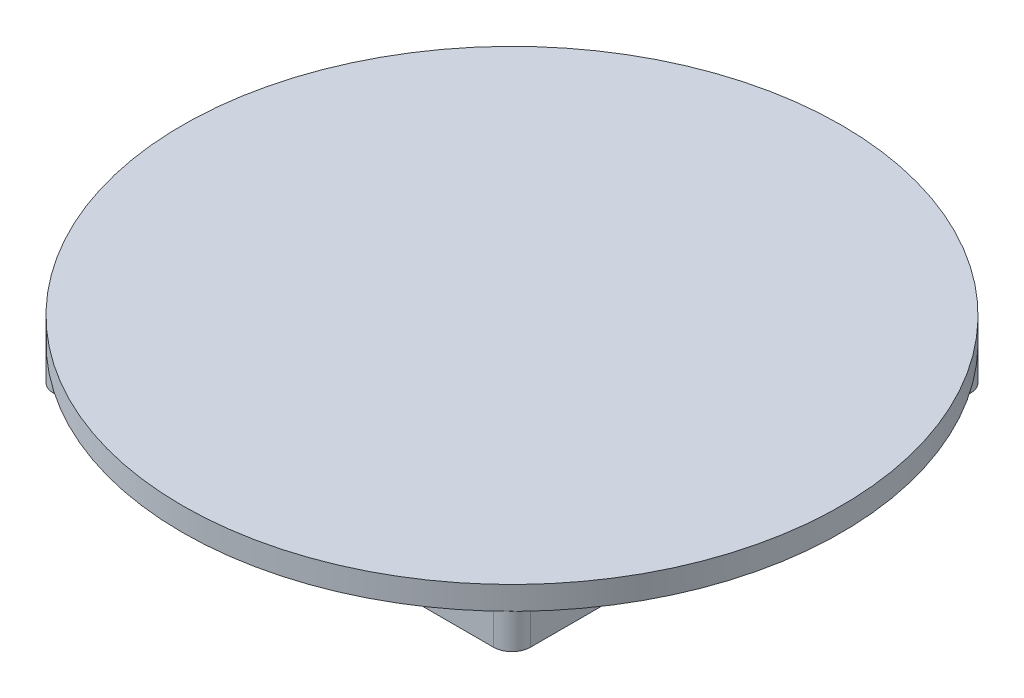
ISO-10303-21;
HEADER;
FILE_DESCRIPTION(('STEP AP214'),'2;1');
FILE_NAME('part.step','',(''),(''),'','','');
FILE_SCHEMA(('AUTOMOTIVE_DESIGN { 1 0 10303 214 1 1 1 1 }'));
ENDSEC;
DATA;
#1=APPLICATION_CONTEXT('core data for automotive mechanical design processes');
#2=APPLICATION_PROTOCOL_DEFINITION('international standard','automotive_design',2000,#1);
#3=PRODUCT_CONTEXT('',#1,'mechanical');
#4=PRODUCT('Part','Part','',(#3));
#5=PRODUCT_RELATED_PRODUCT_CATEGORY('part','',(#4));
#6=PRODUCT_DEFINITION_FORMATION('','',#4);
#7=PRODUCT_DEFINITION_CONTEXT('part definition',#1,'design');
#8=PRODUCT_DEFINITION('design','',#6,#7);
#9=PRODUCT_DEFINITION_SHAPE('','',#8);
#10=(LENGTH_UNIT() NAMED_UNIT(*) SI_UNIT(.MILLI.,.METRE.));
#11=(NAMED_UNIT(*) PLANE_ANGLE_UNIT() SI_UNIT($,.RADIAN.));
#12=(NAMED_UNIT(*) SI_UNIT($,.STERADIAN.) SOLID_ANGLE_UNIT());
#13=UNCERTAINTY_MEASURE_WITH_UNIT(LENGTH_MEASURE(1.E-05),#10,'distance_accuracy_value','');
#14=(GEOMETRIC_REPRESENTATION_CONTEXT(3) GLOBAL_UNCERTAINTY_ASSIGNED_CONTEXT((#13)) GLOBAL_UNIT_ASSIGNED_CONTEXT((#10,
#11,#12)) REPRESENTATION_CONTEXT('',''));
#15=CARTESIAN_POINT('',(0.,0.,0.));
#16=DIRECTION('',(0.,0.,1.));
#17=DIRECTION('',(1.,0.,0.));
#18=AXIS2_PLACEMENT_3D('',#15,#16,#17);
#19=CARTESIAN_POINT('',(5.24606299212598,12.5,16.3435039370079));
#20=DIRECTION('',(0.,-1.,0.));
#21=DIRECTION('',(0.,0.,-1.));
#22=AXIS2_PLACEMENT_3D('',#19,#20,#21);
#23=CYLINDRICAL_SURFACE('',#22,70.8215908221288);
#24=CARTESIAN_POINT('',(5.24606299212598,12.5,16.3435039370079));
#25=DIRECTION('',(0.,1.,0.));
#26=DIRECTION('',(0.,0.,1.));
#27=AXIS2_PLACEMENT_3D('',#24,#25,#26);
#28=CIRCLE('',#27,70.8215908221288);
#29=CARTESIAN_POINT('',(5.24606299212598,12.5,87.1650947591366));
#30=VERTEX_POINT('',#29);
#31=EDGE_CURVE('E11',#30,#30,#28,.T.);
#32=ORIENTED_EDGE('',*,*,#31,.F.);
#33=EDGE_LOOP('',(#32));
#34=FACE_BOUND('',#33,.T.);
#35=CARTESIAN_POINT('',(5.24606299212598,7.5,16.3435039370079));
#36=DIRECTION('',(0.,1.,0.));
#37=DIRECTION('',(0.,0.,1.));
#38=AXIS2_PLACEMENT_3D('',#35,#36,#37);
#39=CIRCLE('',#38,70.8215908221288);
#40=CARTESIAN_POINT('',(5.24606299212598,7.5,87.1650947591366));
#41=VERTEX_POINT('',#40);
#42=EDGE_CURVE('E48',#41,#41,#39,.T.);
#43=ORIENTED_EDGE('',*,*,#42,.T.);
#44=EDGE_LOOP('',(#43));
#45=FACE_BOUND('',#44,.T.);
#46=ADVANCED_FACE('F45',(#34,#45),#23,.T.);
#47=CARTESIAN_POINT('',(5.24606299212598,12.5,16.3435039370079));
#48=DIRECTION('',(0.,1.,0.));
#49=DIRECTION('',(0.,0.,1.));
#50=AXIS2_PLACEMENT_3D('',#47,#48,#49);
#51=PLANE('',#50);
#52=ORIENTED_EDGE('',*,*,#31,.T.);
#53=EDGE_LOOP('',(#52));
#54=FACE_BOUND('',#53,.T.);
#55=ADVANCED_FACE('F60',(#54),#51,.T.);
#56=CARTESIAN_POINT('',(5.24606299212598,7.5,16.3435039370079));
#57=DIRECTION('',(0.,1.,0.));
#58=DIRECTION('',(0.,0.,1.));
#59=AXIS2_PLACEMENT_3D('',#56,#57,#58);
#60=PLANE('',#59);
#61=ORIENTED_EDGE('',*,*,#42,.F.);
#62=EDGE_LOOP('',(#61));
#63=FACE_BOUND('',#62,.T.);
#64=ADVANCED_FACE('F58',(#63),#60,.F.);
#65=CLOSED_SHELL('',(#46,#55,#64));
#66=MANIFOLD_SOLID_BREP('B2_NOT_SHOWN',#65);
#67=CARTESIAN_POINT('',(-42.003937007874,7.5,-30.9064960629921));
#68=DIRECTION('',(0.,-1.,0.));
#69=DIRECTION('',(0.,0.,-1.));
#70=AXIS2_PLACEMENT_3D('',#67,#68,#69);
#71=CYLINDRICAL_SURFACE('',#70,4.00000000000002);
#72=CARTESIAN_POINT('',(-42.003937007874,0.,-30.9064960629921));
#73=DIRECTION('',(0.,1.,0.));
#74=DIRECTION('',(0.,0.,1.));
#75=AXIS2_PLACEMENT_3D('',#72,#73,#74);
#76=CIRCLE('',#75,4.00000000000002);
#77=CARTESIAN_POINT('',(-46.003937007874,0.,-30.9064960629921));
#78=VERTEX_POINT('',#77);
#79=CARTESIAN_POINT('',(-42.003937007874,0.,-34.9064960629921));
#80=VERTEX_POINT('',#79);
#81=EDGE_CURVE('E183',#78,#80,#76,.F.);
#82=ORIENTED_EDGE('',*,*,#81,.F.);
#83=DIRECTION('',(0.,-1.,0.));
#84=VECTOR('',#83,1.);
#85=CARTESIAN_POINT('',(-46.003937007874,7.5,-30.9064960629921));
#86=LINE('',#85,#84);
#87=CARTESIAN_POINT('',(-46.003937007874,7.5,-30.9064960629921));
#88=VERTEX_POINT('',#87);
#89=EDGE_CURVE('E43',#88,#78,#86,.T.);
#90=ORIENTED_EDGE('',*,*,#89,.F.);
#91=CARTESIAN_POINT('',(-42.003937007874,7.5,-30.9064960629921));
#92=DIRECTION('',(0.,1.,0.));
#93=DIRECTION('',(0.,0.,1.));
#94=AXIS2_PLACEMENT_3D('',#91,#92,#93);
#95=CIRCLE('',#94,4.00000000000002);
#96=CARTESIAN_POINT('',(-42.003937007874,7.5,-34.9064960629921));
#97=VERTEX_POINT('',#96);
#98=EDGE_CURVE('E206',#88,#97,#95,.F.);
#99=ORIENTED_EDGE('',*,*,#98,.T.);
#100=DIRECTION('',(0.,-1.,0.));
#101=VECTOR('',#100,1.);
#102=CARTESIAN_POINT('',(-42.003937007874,7.5,-34.9064960629921));
#103=LINE('',#102,#101);
#104=EDGE_CURVE('E102',#97,#80,#103,.T.);
#105=ORIENTED_EDGE('',*,*,#104,.T.);
#106=EDGE_LOOP('',(#82,#90,#99,#105));
#107=FACE_BOUND('',#106,.T.);
#108=ADVANCED_FACE('F86',(#107),#71,.T.);
#109=CARTESIAN_POINT('',(-46.003937007874,7.5,0.));
#110=DIRECTION('',(1.,0.,0.));
#111=DIRECTION('',(0.,0.,-1.));
#112=AXIS2_PLACEMENT_3D('',#109,#110,#111);
#113=PLANE('',#112);
#114=DIRECTION('',(0.,0.,1.));
#115=VECTOR('',#114,1.);
#116=CARTESIAN_POINT('',(-46.003937007874,0.,0.));
#117=LINE('',#116,#115);
#118=CARTESIAN_POINT('',(-46.003937007874,0.,63.5935039370079));
#119=VERTEX_POINT('',#118);
#120=EDGE_CURVE('E185',#78,#119,#117,.T.);
#121=ORIENTED_EDGE('',*,*,#120,.T.);
#122=DIRECTION('',(0.,-1.,0.));
#123=VECTOR('',#122,1.);
#124=CARTESIAN_POINT('',(-46.003937007874,7.5,63.5935039370079));
#125=LINE('',#124,#123);
#126=CARTESIAN_POINT('',(-46.003937007874,7.5,63.5935039370079));
#127=VERTEX_POINT('',#126);
#128=EDGE_CURVE('E94',#127,#119,#125,.T.);
#129=ORIENTED_EDGE('',*,*,#128,.F.);
#130=DIRECTION('',(0.,0.,1.));
#131=VECTOR('',#130,1.);
#132=CARTESIAN_POINT('',(-46.003937007874,7.5,0.));
#133=LINE('',#132,#131);
#134=EDGE_CURVE('E239',#88,#127,#133,.T.);
#135=ORIENTED_EDGE('',*,*,#134,.F.);
#136=ORIENTED_EDGE('',*,*,#89,.T.);
#137=EDGE_LOOP('',(#121,#129,#135,#136));
#138=FACE_BOUND('',#137,.T.);
#139=ADVANCED_FACE('F223',(#138),#113,.F.);
#140=CARTESIAN_POINT('',(-42.003937007874,7.5,63.5935039370079));
#141=DIRECTION('',(0.,-1.,0.));
#142=DIRECTION('',(0.,0.,-1.));
#143=AXIS2_PLACEMENT_3D('',#140,#141,#142);
#144=CYLINDRICAL_SURFACE('',#143,4.00000000000001);
#145=CARTESIAN_POINT('',(-42.003937007874,0.,63.5935039370079));
#146=DIRECTION('',(0.,1.,0.));
#147=DIRECTION('',(0.,0.,1.));
#148=AXIS2_PLACEMENT_3D('',#145,#146,#147);
#149=CIRCLE('',#148,4.00000000000001);
#150=CARTESIAN_POINT('',(-42.003937007874,0.,67.5935039370079));
#151=VERTEX_POINT('',#150);
#152=EDGE_CURVE('E189',#151,#119,#149,.F.);
#153=ORIENTED_EDGE('',*,*,#152,.F.);
#154=DIRECTION('',(0.,-1.,0.));
#155=VECTOR('',#154,1.);
#156=CARTESIAN_POINT('',(-42.003937007874,7.5,67.5935039370079));
#157=LINE('',#156,#155);
#158=CARTESIAN_POINT('',(-42.003937007874,7.5,67.5935039370079));
#159=VERTEX_POINT('',#158);
#160=EDGE_CURVE('E213',#159,#151,#157,.T.);
#161=ORIENTED_EDGE('',*,*,#160,.F.);
#162=CARTESIAN_POINT('',(-42.003937007874,7.5,63.5935039370079));
#163=DIRECTION('',(0.,1.,0.));
#164=DIRECTION('',(0.,0.,1.));
#165=AXIS2_PLACEMENT_3D('',#162,#163,#164);
#166=CIRCLE('',#165,4.00000000000001);
#167=EDGE_CURVE('E220',#159,#127,#166,.F.);
#168=ORIENTED_EDGE('',*,*,#167,.T.);
#169=ORIENTED_EDGE('',*,*,#128,.T.);
#170=EDGE_LOOP('',(#153,#161,#168,#169));
#171=FACE_BOUND('',#170,.T.);
#172=ADVANCED_FACE('F218',(#171),#144,.T.);
#173=CARTESIAN_POINT('',(0.,7.5,67.5935039370078));
#174=DIRECTION('',(0.,0.,-1.));
#175=DIRECTION('',(-1.,0.,0.));
#176=AXIS2_PLACEMENT_3D('',#173,#174,#175);
#177=PLANE('',#176);
#178=DIRECTION('',(1.,0.,0.));
#179=VECTOR('',#178,1.);
#180=CARTESIAN_POINT('',(0.,0.,67.5935039370078));
#181=LINE('',#180,#179);
#182=CARTESIAN_POINT('',(52.496062992126,0.,67.5935039370078));
#183=VERTEX_POINT('',#182);
#184=EDGE_CURVE('E192',#151,#183,#181,.T.);
#185=ORIENTED_EDGE('',*,*,#184,.T.);
#186=DIRECTION('',(0.,-1.,0.));
#187=VECTOR('',#186,1.);
#188=CARTESIAN_POINT('',(52.496062992126,7.5,67.5935039370078));
#189=LINE('',#188,#187);
#190=CARTESIAN_POINT('',(52.496062992126,7.5,67.5935039370078));
#191=VERTEX_POINT('',#190);
#192=EDGE_CURVE('E210',#191,#183,#189,.T.);
#193=ORIENTED_EDGE('',*,*,#192,.F.);
#194=DIRECTION('',(1.,0.,0.));
#195=VECTOR('',#194,1.);
#196=CARTESIAN_POINT('',(0.,7.5,67.5935039370078));
#197=LINE('',#196,#195);
#198=EDGE_CURVE('E235',#159,#191,#197,.T.);
#199=ORIENTED_EDGE('',*,*,#198,.F.);
#200=ORIENTED_EDGE('',*,*,#160,.T.);
#201=EDGE_LOOP('',(#185,#193,#199,#200));
#202=FACE_BOUND('',#201,.T.);
#203=ADVANCED_FACE('F231',(#202),#177,.F.);
#204=CARTESIAN_POINT('',(52.496062992126,7.5,63.5935039370078));
#205=DIRECTION('',(0.,-1.,0.));
#206=DIRECTION('',(0.,0.,-1.));
#207=AXIS2_PLACEMENT_3D('',#204,#205,#206);
#208=CYLINDRICAL_SURFACE('',#207,3.99999999999999);
#209=CARTESIAN_POINT('',(52.496062992126,0.,63.5935039370078));
#210=DIRECTION('',(0.,1.,0.));
#211=DIRECTION('',(0.,0.,1.));
#212=AXIS2_PLACEMENT_3D('',#209,#210,#211);
#213=CIRCLE('',#212,3.99999999999999);
#214=CARTESIAN_POINT('',(56.496062992126,0.,63.5935039370078));
#215=VERTEX_POINT('',#214);
#216=EDGE_CURVE('E194',#183,#215,#213,.T.);
#217=ORIENTED_EDGE('',*,*,#216,.T.);
#218=DIRECTION('',(0.,-1.,0.));
#219=VECTOR('',#218,1.);
#220=CARTESIAN_POINT('',(56.496062992126,7.5,63.5935039370078));
#221=LINE('',#220,#219);
#222=CARTESIAN_POINT('',(56.496062992126,7.5,63.5935039370078));
#223=VERTEX_POINT('',#222);
#224=EDGE_CURVE('E161',#223,#215,#221,.T.);
#225=ORIENTED_EDGE('',*,*,#224,.F.);
#226=CARTESIAN_POINT('',(52.496062992126,7.5,63.5935039370078));
#227=DIRECTION('',(0.,1.,0.));
#228=DIRECTION('',(0.,0.,1.));
#229=AXIS2_PLACEMENT_3D('',#226,#227,#228);
#230=CIRCLE('',#229,3.99999999999999);
#231=EDGE_CURVE('E171',#191,#223,#230,.T.);
#232=ORIENTED_EDGE('',*,*,#231,.F.);
#233=ORIENTED_EDGE('',*,*,#192,.T.);
#234=EDGE_LOOP('',(#217,#225,#232,#233));
#235=FACE_BOUND('',#234,.T.);
#236=ADVANCED_FACE('F234',(#235),#208,.T.);
#237=CARTESIAN_POINT('',(56.496062992126,7.5,0.));
#238=DIRECTION('',(1.,0.,0.));
#239=DIRECTION('',(0.,0.,-1.));
#240=AXIS2_PLACEMENT_3D('',#237,#238,#239);
#241=PLANE('',#240);
#242=DIRECTION('',(0.,0.,1.));
#243=VECTOR('',#242,1.);
#244=CARTESIAN_POINT('',(56.496062992126,0.,0.));
#245=LINE('',#244,#243);
#246=CARTESIAN_POINT('',(56.496062992126,0.,-30.9064960629922));
#247=VERTEX_POINT('',#246);
#248=EDGE_CURVE('E157',#247,#215,#245,.T.);
#249=ORIENTED_EDGE('',*,*,#248,.F.);
#250=DIRECTION('',(0.,-1.,0.));
#251=VECTOR('',#250,1.);
#252=CARTESIAN_POINT('',(56.496062992126,7.5,-30.9064960629922));
#253=LINE('',#252,#251);
#254=CARTESIAN_POINT('',(56.496062992126,7.5,-30.9064960629922));
#255=VERTEX_POINT('',#254);
#256=EDGE_CURVE('E152',#255,#247,#253,.T.);
#257=ORIENTED_EDGE('',*,*,#256,.F.);
#258=DIRECTION('',(0.,0.,1.));
#259=VECTOR('',#258,1.);
#260=CARTESIAN_POINT('',(56.496062992126,7.5,0.));
#261=LINE('',#260,#259);
#262=EDGE_CURVE('E155',#255,#223,#261,.T.);
#263=ORIENTED_EDGE('',*,*,#262,.T.);
#264=ORIENTED_EDGE('',*,*,#224,.T.);
#265=EDGE_LOOP('',(#249,#257,#263,#264));
#266=FACE_BOUND('',#265,.T.);
#267=ADVANCED_FACE('F154',(#266),#241,.T.);
#268=CARTESIAN_POINT('',(52.496062992126,7.5,-30.9064960629921));
#269=DIRECTION('',(0.,-1.,0.));
#270=DIRECTION('',(0.,0.,-1.));
#271=AXIS2_PLACEMENT_3D('',#268,#269,#270);
#272=CYLINDRICAL_SURFACE('',#271,4.00000000000001);
#273=CARTESIAN_POINT('',(52.496062992126,0.,-30.9064960629921));
#274=DIRECTION('',(0.,1.,0.));
#275=DIRECTION('',(0.,0.,1.));
#276=AXIS2_PLACEMENT_3D('',#273,#274,#275);
#277=CIRCLE('',#276,4.00000000000001);
#278=CARTESIAN_POINT('',(52.496062992126,0.,-34.9064960629922));
#279=VERTEX_POINT('',#278);
#280=EDGE_CURVE('E198',#279,#247,#277,.F.);
#281=ORIENTED_EDGE('',*,*,#280,.F.);
#282=DIRECTION('',(0.,-1.,0.));
#283=VECTOR('',#282,1.);
#284=CARTESIAN_POINT('',(52.496062992126,7.5,-34.9064960629922));
#285=LINE('',#284,#283);
#286=CARTESIAN_POINT('',(52.496062992126,7.5,-34.9064960629922));
#287=VERTEX_POINT('',#286);
#288=EDGE_CURVE('E127',#287,#279,#285,.T.);
#289=ORIENTED_EDGE('',*,*,#288,.F.);
#290=CARTESIAN_POINT('',(52.496062992126,7.5,-30.9064960629921));
#291=DIRECTION('',(0.,1.,0.));
#292=DIRECTION('',(0.,0.,1.));
#293=AXIS2_PLACEMENT_3D('',#290,#291,#292);
#294=CIRCLE('',#293,4.00000000000001);
#295=EDGE_CURVE('E169',#287,#255,#294,.F.);
#296=ORIENTED_EDGE('',*,*,#295,.T.);
#297=ORIENTED_EDGE('',*,*,#256,.T.);
#298=EDGE_LOOP('',(#281,#289,#296,#297));
#299=FACE_BOUND('',#298,.T.);
#300=ADVANCED_FACE('F174',(#299),#272,.T.);
#301=CARTESIAN_POINT('',(0.,7.5,-34.9064960629921));
#302=DIRECTION('',(0.,0.,-1.));
#303=DIRECTION('',(-1.,0.,0.));
#304=AXIS2_PLACEMENT_3D('',#301,#302,#303);
#305=PLANE('',#304);
#306=DIRECTION('',(1.,0.,0.));
#307=VECTOR('',#306,1.);
#308=CARTESIAN_POINT('',(0.,0.,-34.9064960629921));
#309=LINE('',#308,#307);
#310=EDGE_CURVE('E200',#80,#279,#309,.T.);
#311=ORIENTED_EDGE('',*,*,#310,.F.);
#312=ORIENTED_EDGE('',*,*,#104,.F.);
#313=DIRECTION('',(1.,0.,0.));
#314=VECTOR('',#313,1.);
#315=CARTESIAN_POINT('',(0.,7.5,-34.9064960629921));
#316=LINE('',#315,#314);
#317=EDGE_CURVE('E175',#97,#287,#316,.T.);
#318=ORIENTED_EDGE('',*,*,#317,.T.);
#319=ORIENTED_EDGE('',*,*,#288,.T.);
#320=EDGE_LOOP('',(#311,#312,#318,#319));
#321=FACE_BOUND('',#320,.T.);
#322=ADVANCED_FACE('F386',(#321),#305,.T.);
#323=CARTESIAN_POINT('',(5.24606299212598,7.5,16.3435039370079));
#324=DIRECTION('',(0.,-1.,0.));
#325=DIRECTION('',(0.,0.,-1.));
#326=AXIS2_PLACEMENT_3D('',#323,#324,#325);
#327=CYLINDRICAL_SURFACE('',#326,27.4);
#328=CARTESIAN_POINT('',(5.24606299212598,7.5,16.3435039370079));
#329=DIRECTION('',(0.,1.,0.));
#330=DIRECTION('',(0.,0.,1.));
#331=AXIS2_PLACEMENT_3D('',#328,#329,#330);
#332=CIRCLE('',#331,27.4);
#333=CARTESIAN_POINT('',(5.24606299212598,7.5,43.7435039370079));
#334=VERTEX_POINT('',#333);
#335=EDGE_CURVE('E177',#334,#334,#332,.T.);
#336=ORIENTED_EDGE('',*,*,#335,.T.);
#337=EDGE_LOOP('',(#336));
#338=FACE_BOUND('',#337,.T.);
#339=CARTESIAN_POINT('',(5.24606299212598,0.,16.3435039370079));
#340=DIRECTION('',(0.,1.,0.));
#341=DIRECTION('',(0.,0.,1.));
#342=AXIS2_PLACEMENT_3D('',#339,#340,#341);
#343=CIRCLE('',#342,27.4);
#344=CARTESIAN_POINT('',(5.24606299212598,0.,43.7435039370079));
#345=VERTEX_POINT('',#344);
#346=EDGE_CURVE('E203',#345,#345,#343,.T.);
#347=ORIENTED_EDGE('',*,*,#346,.F.);
#348=EDGE_LOOP('',(#347));
#349=FACE_BOUND('',#348,.T.);
#350=ADVANCED_FACE('F388',(#338,#349),#327,.F.);
#351=CARTESIAN_POINT('',(0.,7.5,0.));
#352=DIRECTION('',(0.,1.,0.));
#353=DIRECTION('',(0.,0.,1.));
#354=AXIS2_PLACEMENT_3D('',#351,#352,#353);
#355=PLANE('',#354);
#356=CARTESIAN_POINT('',(-35.2039370078742,7.5,56.7935039370077));
#357=DIRECTION('',(0.,1.,0.));
#358=DIRECTION('',(-1.,0.,0.));
#359=AXIS2_PLACEMENT_3D('',#356,#357,#358);
#360=CIRCLE('',#359,1.9);
#361=CARTESIAN_POINT('',(-37.1039370078742,7.5,56.7935039370077));
#362=VERTEX_POINT('',#361);
#363=EDGE_CURVE('E267',#362,#362,#360,.T.);
#364=ORIENTED_EDGE('',*,*,#363,.F.);
#365=EDGE_LOOP('',(#364));
#366=FACE_BOUND('',#365,.T.);
#367=CARTESIAN_POINT('',(40.1960629921263,7.5,-18.6064960629917));
#368=DIRECTION('',(0.,1.,0.));
#369=DIRECTION('',(1.,0.,0.));
#370=AXIS2_PLACEMENT_3D('',#367,#368,#369);
#371=CIRCLE('',#370,1.1);
#372=CARTESIAN_POINT('',(41.2960629921263,7.5,-18.6064960629917));
#373=VERTEX_POINT('',#372);
#374=EDGE_CURVE('E280',#373,#373,#371,.T.);
#375=ORIENTED_EDGE('',*,*,#374,.F.);
#376=EDGE_LOOP('',(#375));
#377=FACE_BOUND('',#376,.T.);
#378=CARTESIAN_POINT('',(-29.7039370078741,7.5,51.2935039370077));
#379=DIRECTION('',(0.,1.,0.));
#380=DIRECTION('',(-1.,0.,0.));
#381=AXIS2_PLACEMENT_3D('',#378,#379,#380);
#382=CIRCLE('',#381,1.1);
#383=CARTESIAN_POINT('',(-30.8039370078741,7.5,51.2935039370077));
#384=VERTEX_POINT('',#383);
#385=EDGE_CURVE('E261',#384,#384,#382,.T.);
#386=ORIENTED_EDGE('',*,*,#385,.F.);
#387=EDGE_LOOP('',(#386));
#388=FACE_BOUND('',#387,.T.);
#389=CARTESIAN_POINT('',(-35.203937007874,7.5,-24.1064960629921));
#390=DIRECTION('',(0.,1.,0.));
#391=DIRECTION('',(0.,0.,-1.));
#392=AXIS2_PLACEMENT_3D('',#389,#390,#391);
#393=CIRCLE('',#392,1.9);
#394=CARTESIAN_POINT('',(-35.203937007874,7.5,-26.0064960629921));
#395=VERTEX_POINT('',#394);
#396=EDGE_CURVE('E254',#395,#395,#393,.T.);
#397=ORIENTED_EDGE('',*,*,#396,.F.);
#398=EDGE_LOOP('',(#397));
#399=FACE_BOUND('',#398,.T.);
#400=CARTESIAN_POINT('',(-29.703937007874,7.5,-18.6064960629921));
#401=DIRECTION('',(0.,1.,0.));
#402=DIRECTION('',(0.,0.,-1.));
#403=AXIS2_PLACEMENT_3D('',#400,#401,#402);
#404=CIRCLE('',#403,1.1);
#405=CARTESIAN_POINT('',(-29.703937007874,7.5,-19.7064960629921));
#406=VERTEX_POINT('',#405);
#407=EDGE_CURVE('E275',#406,#406,#404,.T.);
#408=ORIENTED_EDGE('',*,*,#407,.F.);
#409=EDGE_LOOP('',(#408));
#410=FACE_BOUND('',#409,.T.);
#411=CARTESIAN_POINT('',(45.6960629921264,7.5,-24.1064960629917));
#412=DIRECTION('',(0.,1.,0.));
#413=DIRECTION('',(1.,0.,0.));
#414=AXIS2_PLACEMENT_3D('',#411,#412,#413);
#415=CIRCLE('',#414,1.9);
#416=CARTESIAN_POINT('',(47.5960629921264,7.5,-24.1064960629917));
#417=VERTEX_POINT('',#416);
#418=EDGE_CURVE('E268',#417,#417,#415,.T.);
#419=ORIENTED_EDGE('',*,*,#418,.F.);
#420=EDGE_LOOP('',(#419));
#421=FACE_BOUND('',#420,.T.);
#422=CARTESIAN_POINT('',(45.696062992126,7.5,56.7935039370079));
#423=DIRECTION('',(0.,1.,0.));
#424=DIRECTION('',(0.,0.,1.));
#425=AXIS2_PLACEMENT_3D('',#422,#423,#424);
#426=CIRCLE('',#425,1.9);
#427=CARTESIAN_POINT('',(45.696062992126,7.5,58.6935039370079));
#428=VERTEX_POINT('',#427);
#429=EDGE_CURVE('E249',#428,#428,#426,.T.);
#430=ORIENTED_EDGE('',*,*,#429,.F.);
#431=EDGE_LOOP('',(#430));
#432=FACE_BOUND('',#431,.T.);
#433=CARTESIAN_POINT('',(40.196062992126,7.5,51.2935039370078));
#434=DIRECTION('',(0.,1.,0.));
#435=DIRECTION('',(0.,0.,1.));
#436=AXIS2_PLACEMENT_3D('',#433,#434,#435);
#437=CIRCLE('',#436,1.1);
#438=CARTESIAN_POINT('',(40.196062992126,7.5,52.3935039370078));
#439=VERTEX_POINT('',#438);
#440=EDGE_CURVE('E242',#439,#439,#437,.T.);
#441=ORIENTED_EDGE('',*,*,#440,.F.);
#442=EDGE_LOOP('',(#441));
#443=FACE_BOUND('',#442,.T.);
#444=ORIENTED_EDGE('',*,*,#98,.F.);
#445=ORIENTED_EDGE('',*,*,#134,.T.);
#446=ORIENTED_EDGE('',*,*,#167,.F.);
#447=ORIENTED_EDGE('',*,*,#198,.T.);
#448=ORIENTED_EDGE('',*,*,#231,.T.);
#449=ORIENTED_EDGE('',*,*,#262,.F.);
#450=ORIENTED_EDGE('',*,*,#295,.F.);
#451=ORIENTED_EDGE('',*,*,#317,.F.);
#452=EDGE_LOOP('',(#444,#445,#446,#447,#448,#449,#450,#451));
#453=FACE_BOUND('',#452,.T.);
#454=ORIENTED_EDGE('',*,*,#335,.F.);
#455=EDGE_LOOP('',(#454));
#456=FACE_BOUND('',#455,.T.);
#457=ADVANCED_FACE('F166',(#366,#377,#388,#399,#410,#421,#432,#443,#453,#456),#355,.T.);
#458=CARTESIAN_POINT('',(0.,0.,0.));
#459=DIRECTION('',(0.,1.,0.));
#460=DIRECTION('',(0.,0.,1.));
#461=AXIS2_PLACEMENT_3D('',#458,#459,#460);
#462=PLANE('',#461);
#463=CARTESIAN_POINT('',(-39.6039370078738,0.,-28.5064960629923));
#464=DIRECTION('',(0.,-1.,0.));
#465=DIRECTION('',(1.,0.,0.));
#466=AXIS2_PLACEMENT_3D('',#463,#464,#465);
#467=CIRCLE('',#466,1.9);
#468=CARTESIAN_POINT('',(-37.7039370078738,0.,-28.5064960629923));
#469=VERTEX_POINT('',#468);
#470=EDGE_CURVE('E315',#469,#469,#467,.T.);
#471=ORIENTED_EDGE('',*,*,#470,.F.);
#472=EDGE_LOOP('',(#471));
#473=FACE_BOUND('',#472,.T.);
#474=CARTESIAN_POINT('',(42.7660629921256,0.,53.8635039370083));
#475=DIRECTION('',(0.,-1.,0.));
#476=DIRECTION('',(-1.,0.,0.));
#477=AXIS2_PLACEMENT_3D('',#474,#475,#476);
#478=CIRCLE('',#477,1.1);
#479=CARTESIAN_POINT('',(41.6660629921256,0.,53.8635039370083));
#480=VERTEX_POINT('',#479);
#481=EDGE_CURVE('E328',#480,#480,#478,.T.);
#482=ORIENTED_EDGE('',*,*,#481,.F.);
#483=EDGE_LOOP('',(#482));
#484=FACE_BOUND('',#483,.T.);
#485=CARTESIAN_POINT('',(-32.2739370078739,0.,-21.1764960629923));
#486=DIRECTION('',(0.,-1.,0.));
#487=DIRECTION('',(1.,0.,0.));
#488=AXIS2_PLACEMENT_3D('',#485,#486,#487);
#489=CIRCLE('',#488,1.1);
#490=CARTESIAN_POINT('',(-31.1739370078739,0.,-21.1764960629923));
#491=VERTEX_POINT('',#490);
#492=EDGE_CURVE('E309',#491,#491,#489,.T.);
#493=ORIENTED_EDGE('',*,*,#492,.F.);
#494=EDGE_LOOP('',(#493));
#495=FACE_BOUND('',#494,.T.);
#496=CARTESIAN_POINT('',(50.096062992126,0.,-28.5064960629921));
#497=DIRECTION('',(0.,-1.,0.));
#498=DIRECTION('',(0.,0.,1.));
#499=AXIS2_PLACEMENT_3D('',#496,#497,#498);
#500=CIRCLE('',#499,1.9);
#501=CARTESIAN_POINT('',(50.096062992126,0.,-26.6064960629921));
#502=VERTEX_POINT('',#501);
#503=EDGE_CURVE('E302',#502,#502,#500,.T.);
#504=ORIENTED_EDGE('',*,*,#503,.F.);
#505=EDGE_LOOP('',(#504));
#506=FACE_BOUND('',#505,.T.);
#507=CARTESIAN_POINT('',(42.766062992126,0.,-21.1764960629921));
#508=DIRECTION('',(0.,-1.,0.));
#509=DIRECTION('',(0.,0.,1.));
#510=AXIS2_PLACEMENT_3D('',#507,#508,#509);
#511=CIRCLE('',#510,1.1);
#512=CARTESIAN_POINT('',(42.766062992126,0.,-20.0764960629921));
#513=VERTEX_POINT('',#512);
#514=EDGE_CURVE('E323',#513,#513,#511,.T.);
#515=ORIENTED_EDGE('',*,*,#514,.F.);
#516=EDGE_LOOP('',(#515));
#517=FACE_BOUND('',#516,.T.);
#518=CARTESIAN_POINT('',(50.0960629921255,0.,61.1935039370084));
#519=DIRECTION('',(0.,-1.,0.));
#520=DIRECTION('',(-1.,0.,0.));
#521=AXIS2_PLACEMENT_3D('',#518,#519,#520);
#522=CIRCLE('',#521,1.9);
#523=CARTESIAN_POINT('',(48.1960629921255,0.,61.1935039370083));
#524=VERTEX_POINT('',#523);
#525=EDGE_CURVE('E316',#524,#524,#522,.T.);
#526=ORIENTED_EDGE('',*,*,#525,.F.);
#527=EDGE_LOOP('',(#526));
#528=FACE_BOUND('',#527,.T.);
#529=CARTESIAN_POINT('',(-39.603937007874,0.,61.1935039370079));
#530=DIRECTION('',(0.,-1.,0.));
#531=DIRECTION('',(0.,0.,-1.));
#532=AXIS2_PLACEMENT_3D('',#529,#530,#531);
#533=CIRCLE('',#532,1.9);
#534=CARTESIAN_POINT('',(-39.603937007874,0.,59.2935039370079));
#535=VERTEX_POINT('',#534);
#536=EDGE_CURVE('E297',#535,#535,#533,.T.);
#537=ORIENTED_EDGE('',*,*,#536,.F.);
#538=EDGE_LOOP('',(#537));
#539=FACE_BOUND('',#538,.T.);
#540=CARTESIAN_POINT('',(-32.273937007874,0.,53.8635039370079));
#541=DIRECTION('',(0.,-1.,0.));
#542=DIRECTION('',(0.,0.,-1.));
#543=AXIS2_PLACEMENT_3D('',#540,#541,#542);
#544=CIRCLE('',#543,1.1);
#545=CARTESIAN_POINT('',(-32.273937007874,0.,52.7635039370079));
#546=VERTEX_POINT('',#545);
#547=EDGE_CURVE('E290',#546,#546,#544,.T.);
#548=ORIENTED_EDGE('',*,*,#547,.F.);
#549=EDGE_LOOP('',(#548));
#550=FACE_BOUND('',#549,.T.);
#551=ORIENTED_EDGE('',*,*,#81,.T.);
#552=ORIENTED_EDGE('',*,*,#310,.T.);
#553=ORIENTED_EDGE('',*,*,#280,.T.);
#554=ORIENTED_EDGE('',*,*,#248,.T.);
#555=ORIENTED_EDGE('',*,*,#216,.F.);
#556=ORIENTED_EDGE('',*,*,#184,.F.);
#557=ORIENTED_EDGE('',*,*,#152,.T.);
#558=ORIENTED_EDGE('',*,*,#120,.F.);
#559=EDGE_LOOP('',(#551,#552,#553,#554,#555,#556,#557,#558));
#560=FACE_BOUND('',#559,.T.);
#561=ORIENTED_EDGE('',*,*,#346,.T.);
#562=EDGE_LOOP('',(#561));
#563=FACE_BOUND('',#562,.T.);
#564=ADVANCED_FACE('F226',(#473,#484,#495,#506,#517,#528,#539,#550,#560,#563),#462,.F.);
#565=CARTESIAN_POINT('',(40.196062992126,2.5,51.2935039370078));
#566=DIRECTION('',(0.,1.,0.));
#567=DIRECTION('',(0.,0.,1.));
#568=AXIS2_PLACEMENT_3D('',#565,#566,#567);
#569=CYLINDRICAL_SURFACE('',#568,1.1);
#570=CARTESIAN_POINT('',(40.196062992126,2.5,51.2935039370078));
#571=DIRECTION('',(0.,1.,0.));
#572=DIRECTION('',(0.,0.,1.));
#573=AXIS2_PLACEMENT_3D('',#570,#571,#572);
#574=CIRCLE('',#573,1.1);
#575=CARTESIAN_POINT('',(40.196062992126,2.5,52.3935039370078));
#576=VERTEX_POINT('',#575);
#577=EDGE_CURVE('E245',#576,#576,#574,.T.);
#578=ORIENTED_EDGE('',*,*,#577,.F.);
#579=EDGE_LOOP('',(#578));
#580=FACE_BOUND('',#579,.T.);
#581=ORIENTED_EDGE('',*,*,#440,.T.);
#582=EDGE_LOOP('',(#581));
#583=FACE_BOUND('',#582,.T.);
#584=ADVANCED_FACE('F349',(#580,#583),#569,.F.);
#585=CARTESIAN_POINT('',(40.196062992126,2.5,51.2935039370078));
#586=DIRECTION('',(0.,1.,0.));
#587=DIRECTION('',(0.,0.,1.));
#588=AXIS2_PLACEMENT_3D('',#585,#586,#587);
#589=PLANE('',#588);
#590=ORIENTED_EDGE('',*,*,#577,.T.);
#591=EDGE_LOOP('',(#590));
#592=FACE_BOUND('',#591,.T.);
#593=ADVANCED_FACE('F446',(#592),#589,.T.);
#594=CARTESIAN_POINT('',(45.696062992126,2.5,56.7935039370079));
#595=DIRECTION('',(0.,1.,0.));
#596=DIRECTION('',(0.,0.,1.));
#597=AXIS2_PLACEMENT_3D('',#594,#595,#596);
#598=CYLINDRICAL_SURFACE('',#597,1.9);
#599=CARTESIAN_POINT('',(45.696062992126,2.5,56.7935039370079));
#600=DIRECTION('',(0.,1.,0.));
#601=DIRECTION('',(0.,0.,1.));
#602=AXIS2_PLACEMENT_3D('',#599,#600,#601);
#603=CIRCLE('',#602,1.9);
#604=CARTESIAN_POINT('',(45.696062992126,2.5,58.6935039370079));
#605=VERTEX_POINT('',#604);
#606=EDGE_CURVE('E186',#605,#605,#603,.T.);
#607=ORIENTED_EDGE('',*,*,#606,.F.);
#608=EDGE_LOOP('',(#607));
#609=FACE_BOUND('',#608,.T.);
#610=ORIENTED_EDGE('',*,*,#429,.T.);
#611=EDGE_LOOP('',(#610));
#612=FACE_BOUND('',#611,.T.);
#613=ADVANCED_FACE('F457',(#609,#612),#598,.F.);
#614=CARTESIAN_POINT('',(45.696062992126,2.5,56.7935039370079));
#615=DIRECTION('',(0.,1.,0.));
#616=DIRECTION('',(0.,0.,1.));
#617=AXIS2_PLACEMENT_3D('',#614,#615,#616);
#618=PLANE('',#617);
#619=ORIENTED_EDGE('',*,*,#606,.T.);
#620=EDGE_LOOP('',(#619));
#621=FACE_BOUND('',#620,.T.);
#622=ADVANCED_FACE('F467',(#621),#618,.T.);
#623=CARTESIAN_POINT('',(45.6960629921264,2.5,-24.1064960629917));
#624=DIRECTION('',(0.,1.,0.));
#625=DIRECTION('',(0.,0.,1.));
#626=AXIS2_PLACEMENT_3D('',#623,#624,#625);
#627=CYLINDRICAL_SURFACE('',#626,1.9);
#628=CARTESIAN_POINT('',(45.6960629921264,2.5,-24.1064960629917));
#629=DIRECTION('',(0.,1.,0.));
#630=DIRECTION('',(1.,0.,0.));
#631=AXIS2_PLACEMENT_3D('',#628,#629,#630);
#632=CIRCLE('',#631,1.9);
#633=CARTESIAN_POINT('',(47.5960629921264,2.5,-24.1064960629917));
#634=VERTEX_POINT('',#633);
#635=EDGE_CURVE('E271',#634,#634,#632,.T.);
#636=ORIENTED_EDGE('',*,*,#635,.F.);
#637=EDGE_LOOP('',(#636));
#638=FACE_BOUND('',#637,.T.);
#639=ORIENTED_EDGE('',*,*,#418,.T.);
#640=EDGE_LOOP('',(#639));
#641=FACE_BOUND('',#640,.T.);
#642=ADVANCED_FACE('F477',(#638,#641),#627,.F.);
#643=CARTESIAN_POINT('',(45.6960629921264,2.5,-24.1064960629917));
#644=DIRECTION('',(0.,1.,0.));
#645=DIRECTION('',(1.,0.,0.));
#646=AXIS2_PLACEMENT_3D('',#643,#644,#645);
#647=PLANE('',#646);
#648=ORIENTED_EDGE('',*,*,#635,.T.);
#649=EDGE_LOOP('',(#648));
#650=FACE_BOUND('',#649,.T.);
#651=ADVANCED_FACE('F494',(#650),#647,.T.);
#652=CARTESIAN_POINT('',(-29.703937007874,2.5,-18.6064960629921));
#653=DIRECTION('',(0.,1.,0.));
#654=DIRECTION('',(0.,0.,1.));
#655=AXIS2_PLACEMENT_3D('',#652,#653,#654);
#656=CYLINDRICAL_SURFACE('',#655,1.1);
#657=CARTESIAN_POINT('',(-29.703937007874,2.5,-18.6064960629921));
#658=DIRECTION('',(0.,1.,0.));
#659=DIRECTION('',(0.,0.,-1.));
#660=AXIS2_PLACEMENT_3D('',#657,#658,#659);
#661=CIRCLE('',#660,1.1);
#662=CARTESIAN_POINT('',(-29.703937007874,2.5,-19.7064960629921));
#663=VERTEX_POINT('',#662);
#664=EDGE_CURVE('E258',#663,#663,#661,.T.);
#665=ORIENTED_EDGE('',*,*,#664,.F.);
#666=EDGE_LOOP('',(#665));
#667=FACE_BOUND('',#666,.T.);
#668=ORIENTED_EDGE('',*,*,#407,.T.);
#669=EDGE_LOOP('',(#668));
#670=FACE_BOUND('',#669,.T.);
#671=ADVANCED_FACE('F504',(#667,#670),#656,.F.);
#672=CARTESIAN_POINT('',(-29.703937007874,2.5,-18.6064960629921));
#673=DIRECTION('',(0.,1.,0.));
#674=DIRECTION('',(0.,0.,-1.));
#675=AXIS2_PLACEMENT_3D('',#672,#673,#674);
#676=PLANE('',#675);
#677=ORIENTED_EDGE('',*,*,#664,.T.);
#678=EDGE_LOOP('',(#677));
#679=FACE_BOUND('',#678,.T.);
#680=ADVANCED_FACE('F514',(#679),#676,.T.);
#681=CARTESIAN_POINT('',(-35.203937007874,2.5,-24.1064960629921));
#682=DIRECTION('',(0.,1.,0.));
#683=DIRECTION('',(0.,0.,1.));
#684=AXIS2_PLACEMENT_3D('',#681,#682,#683);
#685=CYLINDRICAL_SURFACE('',#684,1.9);
#686=CARTESIAN_POINT('',(-35.203937007874,2.5,-24.1064960629921));
#687=DIRECTION('',(0.,1.,0.));
#688=DIRECTION('',(0.,0.,-1.));
#689=AXIS2_PLACEMENT_3D('',#686,#687,#688);
#690=CIRCLE('',#689,1.9);
#691=CARTESIAN_POINT('',(-35.203937007874,2.5,-26.0064960629921));
#692=VERTEX_POINT('',#691);
#693=EDGE_CURVE('E257',#692,#692,#690,.T.);
#694=ORIENTED_EDGE('',*,*,#693,.F.);
#695=EDGE_LOOP('',(#694));
#696=FACE_BOUND('',#695,.T.);
#697=ORIENTED_EDGE('',*,*,#396,.T.);
#698=EDGE_LOOP('',(#697));
#699=FACE_BOUND('',#698,.T.);
#700=ADVANCED_FACE('F524',(#696,#699),#685,.F.);
#701=CARTESIAN_POINT('',(-35.203937007874,2.5,-24.1064960629921));
#702=DIRECTION('',(0.,1.,0.));
#703=DIRECTION('',(0.,0.,-1.));
#704=AXIS2_PLACEMENT_3D('',#701,#702,#703);
#705=PLANE('',#704);
#706=ORIENTED_EDGE('',*,*,#693,.T.);
#707=EDGE_LOOP('',(#706));
#708=FACE_BOUND('',#707,.T.);
#709=ADVANCED_FACE('F534',(#708),#705,.T.);
#710=CARTESIAN_POINT('',(-29.7039370078741,2.5,51.2935039370077));
#711=DIRECTION('',(0.,1.,0.));
#712=DIRECTION('',(0.,0.,1.));
#713=AXIS2_PLACEMENT_3D('',#710,#711,#712);
#714=CYLINDRICAL_SURFACE('',#713,1.1);
#715=CARTESIAN_POINT('',(-29.7039370078741,2.5,51.2935039370077));
#716=DIRECTION('',(0.,1.,0.));
#717=DIRECTION('',(-1.,0.,0.));
#718=AXIS2_PLACEMENT_3D('',#715,#716,#717);
#719=CIRCLE('',#718,1.1);
#720=CARTESIAN_POINT('',(-30.8039370078741,2.5,51.2935039370077));
#721=VERTEX_POINT('',#720);
#722=EDGE_CURVE('E264',#721,#721,#719,.T.);
#723=ORIENTED_EDGE('',*,*,#722,.F.);
#724=EDGE_LOOP('',(#723));
#725=FACE_BOUND('',#724,.T.);
#726=ORIENTED_EDGE('',*,*,#385,.T.);
#727=EDGE_LOOP('',(#726));
#728=FACE_BOUND('',#727,.T.);
#729=ADVANCED_FACE('F544',(#725,#728),#714,.F.);
#730=CARTESIAN_POINT('',(-29.7039370078741,2.5,51.2935039370077));
#731=DIRECTION('',(0.,1.,0.));
#732=DIRECTION('',(-1.,0.,0.));
#733=AXIS2_PLACEMENT_3D('',#730,#731,#732);
#734=PLANE('',#733);
#735=ORIENTED_EDGE('',*,*,#722,.T.);
#736=EDGE_LOOP('',(#735));
#737=FACE_BOUND('',#736,.T.);
#738=ADVANCED_FACE('F554',(#737),#734,.T.);
#739=CARTESIAN_POINT('',(40.1960629921263,2.5,-18.6064960629917));
#740=DIRECTION('',(0.,1.,0.));
#741=DIRECTION('',(0.,0.,1.));
#742=AXIS2_PLACEMENT_3D('',#739,#740,#741);
#743=CYLINDRICAL_SURFACE('',#742,1.1);
#744=CARTESIAN_POINT('',(40.1960629921263,2.5,-18.6064960629917));
#745=DIRECTION('',(0.,1.,0.));
#746=DIRECTION('',(1.,0.,0.));
#747=AXIS2_PLACEMENT_3D('',#744,#745,#746);
#748=CIRCLE('',#747,1.1);
#749=CARTESIAN_POINT('',(41.2960629921263,2.5,-18.6064960629917));
#750=VERTEX_POINT('',#749);
#751=EDGE_CURVE('E272',#750,#750,#748,.T.);
#752=ORIENTED_EDGE('',*,*,#751,.F.);
#753=EDGE_LOOP('',(#752));
#754=FACE_BOUND('',#753,.T.);
#755=ORIENTED_EDGE('',*,*,#374,.T.);
#756=EDGE_LOOP('',(#755));
#757=FACE_BOUND('',#756,.T.);
#758=ADVANCED_FACE('F564',(#754,#757),#743,.F.);
#759=CARTESIAN_POINT('',(40.1960629921263,2.5,-18.6064960629917));
#760=DIRECTION('',(0.,1.,0.));
#761=DIRECTION('',(1.,0.,0.));
#762=AXIS2_PLACEMENT_3D('',#759,#760,#761);
#763=PLANE('',#762);
#764=ORIENTED_EDGE('',*,*,#751,.T.);
#765=EDGE_LOOP('',(#764));
#766=FACE_BOUND('',#765,.T.);
#767=ADVANCED_FACE('F574',(#766),#763,.T.);
#768=CARTESIAN_POINT('',(-35.2039370078742,2.5,56.7935039370077));
#769=DIRECTION('',(0.,1.,0.));
#770=DIRECTION('',(0.,0.,1.));
#771=AXIS2_PLACEMENT_3D('',#768,#769,#770);
#772=CYLINDRICAL_SURFACE('',#771,1.9);
#773=CARTESIAN_POINT('',(-35.2039370078742,2.5,56.7935039370077));
#774=DIRECTION('',(0.,1.,0.));
#775=DIRECTION('',(-1.,0.,0.));
#776=AXIS2_PLACEMENT_3D('',#773,#774,#775);
#777=CIRCLE('',#776,1.9);
#778=CARTESIAN_POINT('',(-37.1039370078742,2.5,56.7935039370077));
#779=VERTEX_POINT('',#778);
#780=EDGE_CURVE('E246',#779,#779,#777,.T.);
#781=ORIENTED_EDGE('',*,*,#780,.F.);
#782=EDGE_LOOP('',(#781));
#783=FACE_BOUND('',#782,.T.);
#784=ORIENTED_EDGE('',*,*,#363,.T.);
#785=EDGE_LOOP('',(#784));
#786=FACE_BOUND('',#785,.T.);
#787=ADVANCED_FACE('F378',(#783,#786),#772,.F.);
#788=CARTESIAN_POINT('',(-35.2039370078742,2.5,56.7935039370077));
#789=DIRECTION('',(0.,1.,0.));
#790=DIRECTION('',(-1.,0.,0.));
#791=AXIS2_PLACEMENT_3D('',#788,#789,#790);
#792=PLANE('',#791);
#793=ORIENTED_EDGE('',*,*,#780,.T.);
#794=EDGE_LOOP('',(#793));
#795=FACE_BOUND('',#794,.T.);
#796=ADVANCED_FACE('F368',(#795),#792,.T.);
#797=CARTESIAN_POINT('',(-32.273937007874,5.,53.8635039370079));
#798=DIRECTION('',(0.,-1.,0.));
#799=DIRECTION('',(0.,0.,-1.));
#800=AXIS2_PLACEMENT_3D('',#797,#798,#799);
#801=CYLINDRICAL_SURFACE('',#800,1.1);
#802=CARTESIAN_POINT('',(-32.273937007874,5.,53.8635039370079));
#803=DIRECTION('',(0.,-1.,0.));
#804=DIRECTION('',(0.,0.,-1.));
#805=AXIS2_PLACEMENT_3D('',#802,#803,#804);
#806=CIRCLE('',#805,1.1);
#807=CARTESIAN_POINT('',(-32.273937007874,5.,52.7635039370079));
#808=VERTEX_POINT('',#807);
#809=EDGE_CURVE('E293',#808,#808,#806,.T.);
#810=ORIENTED_EDGE('',*,*,#809,.F.);
#811=EDGE_LOOP('',(#810));
#812=FACE_BOUND('',#811,.T.);
#813=ORIENTED_EDGE('',*,*,#547,.T.);
#814=EDGE_LOOP('',(#813));
#815=FACE_BOUND('',#814,.T.);
#816=ADVANCED_FACE('F365',(#812,#815),#801,.F.);
#817=CARTESIAN_POINT('',(-32.273937007874,5.,53.8635039370079));
#818=DIRECTION('',(0.,-1.,0.));
#819=DIRECTION('',(0.,0.,-1.));
#820=AXIS2_PLACEMENT_3D('',#817,#818,#819);
#821=PLANE('',#820);
#822=ORIENTED_EDGE('',*,*,#809,.T.);
#823=EDGE_LOOP('',(#822));
#824=FACE_BOUND('',#823,.T.);
#825=ADVANCED_FACE('F367',(#824),#821,.T.);
#826=CARTESIAN_POINT('',(-39.603937007874,5.,61.1935039370079));
#827=DIRECTION('',(0.,-1.,0.));
#828=DIRECTION('',(0.,0.,-1.));
#829=AXIS2_PLACEMENT_3D('',#826,#827,#828);
#830=CYLINDRICAL_SURFACE('',#829,1.9);
#831=CARTESIAN_POINT('',(-39.603937007874,5.,61.1935039370079));
#832=DIRECTION('',(0.,-1.,0.));
#833=DIRECTION('',(0.,0.,-1.));
#834=AXIS2_PLACEMENT_3D('',#831,#832,#833);
#835=CIRCLE('',#834,1.9);
#836=CARTESIAN_POINT('',(-39.603937007874,5.,59.2935039370079));
#837=VERTEX_POINT('',#836);
#838=EDGE_CURVE('E283',#837,#837,#835,.T.);
#839=ORIENTED_EDGE('',*,*,#838,.F.);
#840=EDGE_LOOP('',(#839));
#841=FACE_BOUND('',#840,.T.);
#842=ORIENTED_EDGE('',*,*,#536,.T.);
#843=EDGE_LOOP('',(#842));
#844=FACE_BOUND('',#843,.T.);
#845=ADVANCED_FACE('F375',(#841,#844),#830,.F.);
#846=CARTESIAN_POINT('',(-39.603937007874,5.,61.1935039370079));
#847=DIRECTION('',(0.,-1.,0.));
#848=DIRECTION('',(0.,0.,-1.));
#849=AXIS2_PLACEMENT_3D('',#846,#847,#848);
#850=PLANE('',#849);
#851=ORIENTED_EDGE('',*,*,#838,.T.);
#852=EDGE_LOOP('',(#851));
#853=FACE_BOUND('',#852,.T.);
#854=ADVANCED_FACE('F618',(#853),#850,.T.);
#855=CARTESIAN_POINT('',(50.0960629921255,5.,61.1935039370084));
#856=DIRECTION('',(0.,-1.,0.));
#857=DIRECTION('',(0.,0.,-1.));
#858=AXIS2_PLACEMENT_3D('',#855,#856,#857);
#859=CYLINDRICAL_SURFACE('',#858,1.9);
#860=CARTESIAN_POINT('',(50.0960629921255,5.,61.1935039370084));
#861=DIRECTION('',(0.,-1.,0.));
#862=DIRECTION('',(-1.,0.,0.));
#863=AXIS2_PLACEMENT_3D('',#860,#861,#862);
#864=CIRCLE('',#863,1.9);
#865=CARTESIAN_POINT('',(48.1960629921255,5.,61.1935039370083));
#866=VERTEX_POINT('',#865);
#867=EDGE_CURVE('E319',#866,#866,#864,.T.);
#868=ORIENTED_EDGE('',*,*,#867,.F.);
#869=EDGE_LOOP('',(#868));
#870=FACE_BOUND('',#869,.T.);
#871=ORIENTED_EDGE('',*,*,#525,.T.);
#872=EDGE_LOOP('',(#871));
#873=FACE_BOUND('',#872,.T.);
#874=ADVANCED_FACE('F628',(#870,#873),#859,.F.);
#875=CARTESIAN_POINT('',(50.0960629921255,5.,61.1935039370084));
#876=DIRECTION('',(0.,-1.,0.));
#877=DIRECTION('',(-1.,0.,0.));
#878=AXIS2_PLACEMENT_3D('',#875,#876,#877);
#879=PLANE('',#878);
#880=ORIENTED_EDGE('',*,*,#867,.T.);
#881=EDGE_LOOP('',(#880));
#882=FACE_BOUND('',#881,.T.);
#883=ADVANCED_FACE('F643',(#882),#879,.T.);
#884=CARTESIAN_POINT('',(42.766062992126,5.,-21.1764960629921));
#885=DIRECTION('',(0.,-1.,0.));
#886=DIRECTION('',(0.,0.,-1.));
#887=AXIS2_PLACEMENT_3D('',#884,#885,#886);
#888=CYLINDRICAL_SURFACE('',#887,1.1);
#889=CARTESIAN_POINT('',(42.766062992126,5.,-21.1764960629921));
#890=DIRECTION('',(0.,-1.,0.));
#891=DIRECTION('',(0.,0.,1.));
#892=AXIS2_PLACEMENT_3D('',#889,#890,#891);
#893=CIRCLE('',#892,1.1);
#894=CARTESIAN_POINT('',(42.766062992126,5.,-20.0764960629921));
#895=VERTEX_POINT('',#894);
#896=EDGE_CURVE('E306',#895,#895,#893,.T.);
#897=ORIENTED_EDGE('',*,*,#896,.F.);
#898=EDGE_LOOP('',(#897));
#899=FACE_BOUND('',#898,.T.);
#900=ORIENTED_EDGE('',*,*,#514,.T.);
#901=EDGE_LOOP('',(#900));
#902=FACE_BOUND('',#901,.T.);
#903=ADVANCED_FACE('F653',(#899,#902),#888,.F.);
#904=CARTESIAN_POINT('',(42.766062992126,5.,-21.1764960629921));
#905=DIRECTION('',(0.,-1.,0.));
#906=DIRECTION('',(0.,0.,1.));
#907=AXIS2_PLACEMENT_3D('',#904,#905,#906);
#908=PLANE('',#907);
#909=ORIENTED_EDGE('',*,*,#896,.T.);
#910=EDGE_LOOP('',(#909));
#911=FACE_BOUND('',#910,.T.);
#912=ADVANCED_FACE('F663',(#911),#908,.T.);
#913=CARTESIAN_POINT('',(50.096062992126,5.,-28.5064960629921));
#914=DIRECTION('',(0.,-1.,0.));
#915=DIRECTION('',(0.,0.,-1.));
#916=AXIS2_PLACEMENT_3D('',#913,#914,#915);
#917=CYLINDRICAL_SURFACE('',#916,1.9);
#918=CARTESIAN_POINT('',(50.096062992126,5.,-28.5064960629921));
#919=DIRECTION('',(0.,-1.,0.));
#920=DIRECTION('',(0.,0.,1.));
#921=AXIS2_PLACEMENT_3D('',#918,#919,#920);
#922=CIRCLE('',#921,1.9);
#923=CARTESIAN_POINT('',(50.096062992126,5.,-26.6064960629921));
#924=VERTEX_POINT('',#923);
#925=EDGE_CURVE('E305',#924,#924,#922,.T.);
#926=ORIENTED_EDGE('',*,*,#925,.F.);
#927=EDGE_LOOP('',(#926));
#928=FACE_BOUND('',#927,.T.);
#929=ORIENTED_EDGE('',*,*,#503,.T.);
#930=EDGE_LOOP('',(#929));
#931=FACE_BOUND('',#930,.T.);
#932=ADVANCED_FACE('F673',(#928,#931),#917,.F.);
#933=CARTESIAN_POINT('',(50.096062992126,5.,-28.5064960629921));
#934=DIRECTION('',(0.,-1.,0.));
#935=DIRECTION('',(0.,0.,1.));
#936=AXIS2_PLACEMENT_3D('',#933,#934,#935);
#937=PLANE('',#936);
#938=ORIENTED_EDGE('',*,*,#925,.T.);
#939=EDGE_LOOP('',(#938));
#940=FACE_BOUND('',#939,.T.);
#941=ADVANCED_FACE('F683',(#940),#937,.T.);
#942=CARTESIAN_POINT('',(-32.2739370078739,5.,-21.1764960629923));
#943=DIRECTION('',(0.,-1.,0.));
#944=DIRECTION('',(0.,0.,-1.));
#945=AXIS2_PLACEMENT_3D('',#942,#943,#944);
#946=CYLINDRICAL_SURFACE('',#945,1.1);
#947=CARTESIAN_POINT('',(-32.2739370078739,5.,-21.1764960629923));
#948=DIRECTION('',(0.,-1.,0.));
#949=DIRECTION('',(1.,0.,0.));
#950=AXIS2_PLACEMENT_3D('',#947,#948,#949);
#951=CIRCLE('',#950,1.1);
#952=CARTESIAN_POINT('',(-31.1739370078739,5.,-21.1764960629923));
#953=VERTEX_POINT('',#952);
#954=EDGE_CURVE('E312',#953,#953,#951,.T.);
#955=ORIENTED_EDGE('',*,*,#954,.F.);
#956=EDGE_LOOP('',(#955));
#957=FACE_BOUND('',#956,.T.);
#958=ORIENTED_EDGE('',*,*,#492,.T.);
#959=EDGE_LOOP('',(#958));
#960=FACE_BOUND('',#959,.T.);
#961=ADVANCED_FACE('F693',(#957,#960),#946,.F.);
#962=CARTESIAN_POINT('',(-32.2739370078739,5.,-21.1764960629923));
#963=DIRECTION('',(0.,-1.,0.));
#964=DIRECTION('',(1.,0.,0.));
#965=AXIS2_PLACEMENT_3D('',#962,#963,#964);
#966=PLANE('',#965);
#967=ORIENTED_EDGE('',*,*,#954,.T.);
#968=EDGE_LOOP('',(#967));
#969=FACE_BOUND('',#968,.T.);
#970=ADVANCED_FACE('F703',(#969),#966,.T.);
#971=CARTESIAN_POINT('',(42.7660629921256,5.,53.8635039370083));
#972=DIRECTION('',(0.,-1.,0.));
#973=DIRECTION('',(0.,0.,-1.));
#974=AXIS2_PLACEMENT_3D('',#971,#972,#973);
#975=CYLINDRICAL_SURFACE('',#974,1.1);
#976=CARTESIAN_POINT('',(42.7660629921256,5.,53.8635039370083));
#977=DIRECTION('',(0.,-1.,0.));
#978=DIRECTION('',(-1.,0.,0.));
#979=AXIS2_PLACEMENT_3D('',#976,#977,#978);
#980=CIRCLE('',#979,1.1);
#981=CARTESIAN_POINT('',(41.6660629921256,5.,53.8635039370083));
#982=VERTEX_POINT('',#981);
#983=EDGE_CURVE('E320',#982,#982,#980,.T.);
#984=ORIENTED_EDGE('',*,*,#983,.F.);
#985=EDGE_LOOP('',(#984));
#986=FACE_BOUND('',#985,.T.);
#987=ORIENTED_EDGE('',*,*,#481,.T.);
#988=EDGE_LOOP('',(#987));
#989=FACE_BOUND('',#988,.T.);
#990=ADVANCED_FACE('F713',(#986,#989),#975,.F.);
#991=CARTESIAN_POINT('',(42.7660629921256,5.,53.8635039370083));
#992=DIRECTION('',(0.,-1.,0.));
#993=DIRECTION('',(-1.,0.,0.));
#994=AXIS2_PLACEMENT_3D('',#991,#992,#993);
#995=PLANE('',#994);
#996=ORIENTED_EDGE('',*,*,#983,.T.);
#997=EDGE_LOOP('',(#996));
#998=FACE_BOUND('',#997,.T.);
#999=ADVANCED_FACE('F343',(#998),#995,.T.);
#1000=CARTESIAN_POINT('',(-39.6039370078738,5.,-28.5064960629923));
#1001=DIRECTION('',(0.,-1.,0.));
#1002=DIRECTION('',(0.,0.,-1.));
#1003=AXIS2_PLACEMENT_3D('',#1000,#1001,#1002);
#1004=CYLINDRICAL_SURFACE('',#1003,1.9);
#1005=CARTESIAN_POINT('',(-39.6039370078738,5.,-28.5064960629923));
#1006=DIRECTION('',(0.,-1.,0.));
#1007=DIRECTION('',(1.,0.,0.));
#1008=AXIS2_PLACEMENT_3D('',#1005,#1006,#1007);
#1009=CIRCLE('',#1008,1.9);
#1010=CARTESIAN_POINT('',(-37.7039370078738,5.,-28.5064960629923));
#1011=VERTEX_POINT('',#1010);
#1012=EDGE_CURVE('E294',#1011,#1011,#1009,.T.);
#1013=ORIENTED_EDGE('',*,*,#1012,.F.);
#1014=EDGE_LOOP('',(#1013));
#1015=FACE_BOUND('',#1014,.T.);
#1016=ORIENTED_EDGE('',*,*,#470,.T.);
#1017=EDGE_LOOP('',(#1016));
#1018=FACE_BOUND('',#1017,.T.);
#1019=ADVANCED_FACE('F340',(#1015,#1018),#1004,.F.);
#1020=CARTESIAN_POINT('',(-39.6039370078738,5.,-28.5064960629923));
#1021=DIRECTION('',(0.,-1.,0.));
#1022=DIRECTION('',(1.,0.,0.));
#1023=AXIS2_PLACEMENT_3D('',#1020,#1021,#1022);
#1024=PLANE('',#1023);
#1025=ORIENTED_EDGE('',*,*,#1012,.T.);
#1026=EDGE_LOOP('',(#1025));
#1027=FACE_BOUND('',#1026,.T.);
#1028=ADVANCED_FACE('F338',(#1027),#1024,.T.);
#1029=CLOSED_SHELL('',(#108,#139,#172,#203,#236,#267,#300,#322,#350,#457,#564,#584,#593,#613,
#622,#642,#651,#671,#680,#700,#709,#729,#738,#758,#767,#787,#796,#816,#825,#845,#854,#874,#883,
#903,#912,#932,#941,#961,#970,#990,#999,#1019,#1028));
#1030=MANIFOLD_SOLID_BREP('B6',#1029);
#1031=ADVANCED_BREP_SHAPE_REPRESENTATION('',(#18,#66,#1030),#14);
#1032=SHAPE_DEFINITION_REPRESENTATION(#9,#1031);
ENDSEC;
END-ISO-10303-21;
